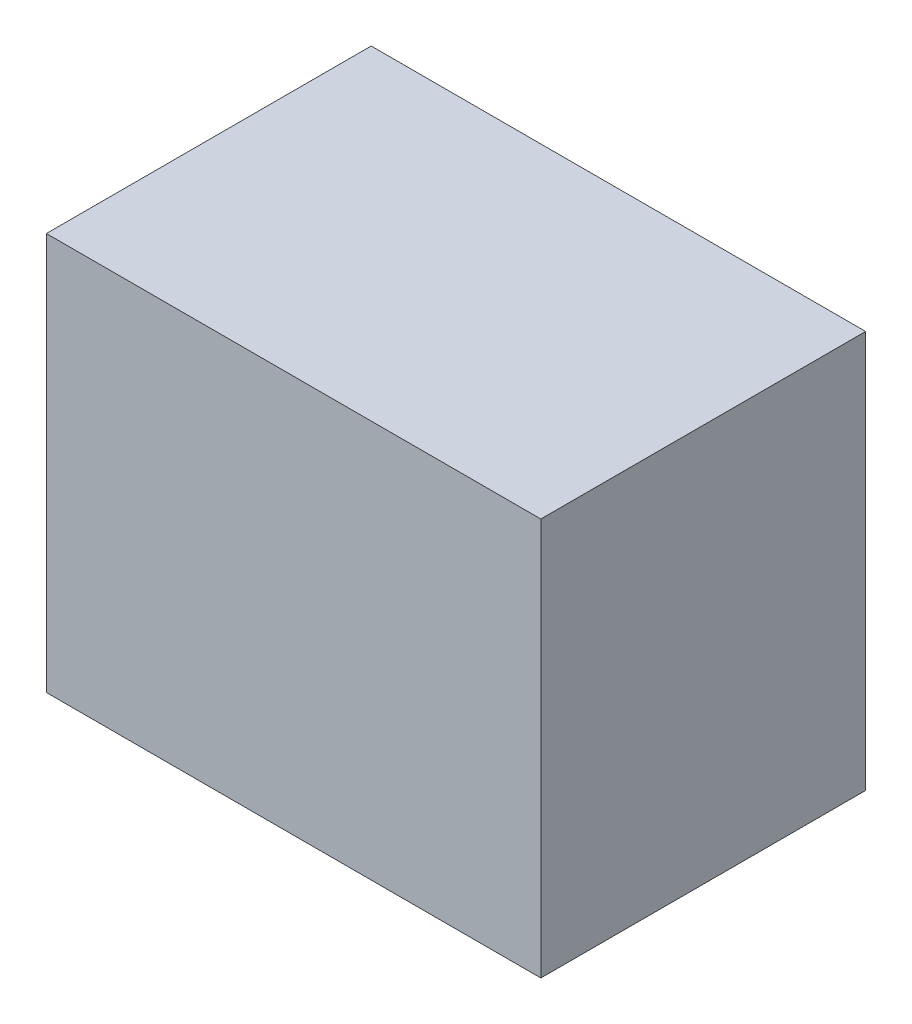
ISO-10303-21;
HEADER;
FILE_DESCRIPTION(('STEP AP214'),'2;1');
FILE_NAME('part.step','',(''),(''),'','','');
FILE_SCHEMA(('AUTOMOTIVE_DESIGN { 1 0 10303 214 1 1 1 1 }'));
ENDSEC;
DATA;
#1=APPLICATION_CONTEXT('core data for automotive mechanical design processes');
#2=APPLICATION_PROTOCOL_DEFINITION('international standard','automotive_design',2000,#1);
#3=PRODUCT_CONTEXT('',#1,'mechanical');
#4=PRODUCT('Part','Part','',(#3));
#5=PRODUCT_RELATED_PRODUCT_CATEGORY('part','',(#4));
#6=PRODUCT_DEFINITION_FORMATION('','',#4);
#7=PRODUCT_DEFINITION_CONTEXT('part definition',#1,'design');
#8=PRODUCT_DEFINITION('design','',#6,#7);
#9=PRODUCT_DEFINITION_SHAPE('','',#8);
#10=(LENGTH_UNIT() NAMED_UNIT(*) SI_UNIT(.MILLI.,.METRE.));
#11=(NAMED_UNIT(*) PLANE_ANGLE_UNIT() SI_UNIT($,.RADIAN.));
#12=(NAMED_UNIT(*) SI_UNIT($,.STERADIAN.) SOLID_ANGLE_UNIT());
#13=UNCERTAINTY_MEASURE_WITH_UNIT(LENGTH_MEASURE(1.E-05),#10,'distance_accuracy_value','');
#14=(GEOMETRIC_REPRESENTATION_CONTEXT(3) GLOBAL_UNCERTAINTY_ASSIGNED_CONTEXT((#13)) GLOBAL_UNIT_ASSIGNED_CONTEXT((#10,
#11,#12)) REPRESENTATION_CONTEXT('',''));
#15=CARTESIAN_POINT('',(0.,0.,0.));
#16=DIRECTION('',(0.,0.,1.));
#17=DIRECTION('',(1.,0.,0.));
#18=AXIS2_PLACEMENT_3D('',#15,#16,#17);
#19=CARTESIAN_POINT('',(0.,208.28,0.));
#20=DIRECTION('',(1.,0.,0.));
#21=DIRECTION('',(0.,0.,-1.));
#22=AXIS2_PLACEMENT_3D('',#19,#20,#21);
#23=PLANE('',#22);
#24=DIRECTION('',(0.,0.,1.));
#25=VECTOR('',#24,1.);
#26=CARTESIAN_POINT('',(0.,0.,0.));
#27=LINE('',#26,#25);
#28=CARTESIAN_POINT('',(0.,0.,-170.18));
#29=VERTEX_POINT('',#28);
#30=CARTESIAN_POINT('',(0.,0.,0.));
#31=VERTEX_POINT('',#30);
#32=EDGE_CURVE('E96',#29,#31,#27,.T.);
#33=ORIENTED_EDGE('',*,*,#32,.T.);
#34=DIRECTION('',(0.,-1.,0.));
#35=VECTOR('',#34,1.);
#36=CARTESIAN_POINT('',(0.,208.28,0.));
#37=LINE('',#36,#35);
#38=CARTESIAN_POINT('',(0.,208.28,0.));
#39=VERTEX_POINT('',#38);
#40=EDGE_CURVE('E11',#39,#31,#37,.T.);
#41=ORIENTED_EDGE('',*,*,#40,.F.);
#42=DIRECTION('',(0.,0.,1.));
#43=VECTOR('',#42,1.);
#44=CARTESIAN_POINT('',(0.,208.28,0.));
#45=LINE('',#44,#43);
#46=CARTESIAN_POINT('',(0.,208.28,-170.18));
#47=VERTEX_POINT('',#46);
#48=EDGE_CURVE('E84',#47,#39,#45,.T.);
#49=ORIENTED_EDGE('',*,*,#48,.F.);
#50=DIRECTION('',(0.,-1.,0.));
#51=VECTOR('',#50,1.);
#52=CARTESIAN_POINT('',(0.,208.28,-170.18));
#53=LINE('',#52,#51);
#54=EDGE_CURVE('E92',#47,#29,#53,.T.);
#55=ORIENTED_EDGE('',*,*,#54,.T.);
#56=EDGE_LOOP('',(#33,#41,#49,#55));
#57=FACE_BOUND('',#56,.T.);
#58=ADVANCED_FACE('F33',(#57),#23,.F.);
#59=CARTESIAN_POINT('',(0.,208.28,0.));
#60=DIRECTION('',(0.,0.,-1.));
#61=DIRECTION('',(-1.,0.,0.));
#62=AXIS2_PLACEMENT_3D('',#59,#60,#61);
#63=PLANE('',#62);
#64=DIRECTION('',(1.,0.,0.));
#65=VECTOR('',#64,1.);
#66=CARTESIAN_POINT('',(0.,0.,0.));
#67=LINE('',#66,#65);
#68=CARTESIAN_POINT('',(259.08,0.,0.));
#69=VERTEX_POINT('',#68);
#70=EDGE_CURVE('E88',#31,#69,#67,.T.);
#71=ORIENTED_EDGE('',*,*,#70,.T.);
#72=DIRECTION('',(0.,-1.,0.));
#73=VECTOR('',#72,1.);
#74=CARTESIAN_POINT('',(259.08,208.28,0.));
#75=LINE('',#74,#73);
#76=CARTESIAN_POINT('',(259.08,208.28,0.));
#77=VERTEX_POINT('',#76);
#78=EDGE_CURVE('E41',#77,#69,#75,.T.);
#79=ORIENTED_EDGE('',*,*,#78,.F.);
#80=DIRECTION('',(1.,0.,0.));
#81=VECTOR('',#80,1.);
#82=CARTESIAN_POINT('',(0.,208.28,0.));
#83=LINE('',#82,#81);
#84=EDGE_CURVE('E79',#39,#77,#83,.T.);
#85=ORIENTED_EDGE('',*,*,#84,.F.);
#86=ORIENTED_EDGE('',*,*,#40,.T.);
#87=EDGE_LOOP('',(#71,#79,#85,#86));
#88=FACE_BOUND('',#87,.T.);
#89=ADVANCED_FACE('F87',(#88),#63,.F.);
#90=CARTESIAN_POINT('',(259.08,208.28,0.));
#91=DIRECTION('',(-1.,0.,0.));
#92=DIRECTION('',(0.,0.,1.));
#93=AXIS2_PLACEMENT_3D('',#90,#91,#92);
#94=PLANE('',#93);
#95=DIRECTION('',(0.,0.,-1.));
#96=VECTOR('',#95,1.);
#97=CARTESIAN_POINT('',(259.08,0.,0.));
#98=LINE('',#97,#96);
#99=CARTESIAN_POINT('',(259.08,0.,-170.18));
#100=VERTEX_POINT('',#99);
#101=EDGE_CURVE('E66',#69,#100,#98,.T.);
#102=ORIENTED_EDGE('',*,*,#101,.T.);
#103=DIRECTION('',(0.,-1.,0.));
#104=VECTOR('',#103,1.);
#105=CARTESIAN_POINT('',(259.08,208.28,-170.18));
#106=LINE('',#105,#104);
#107=CARTESIAN_POINT('',(259.08,208.28,-170.18));
#108=VERTEX_POINT('',#107);
#109=EDGE_CURVE('E89',#108,#100,#106,.T.);
#110=ORIENTED_EDGE('',*,*,#109,.F.);
#111=DIRECTION('',(0.,0.,-1.));
#112=VECTOR('',#111,1.);
#113=CARTESIAN_POINT('',(259.08,208.28,0.));
#114=LINE('',#113,#112);
#115=EDGE_CURVE('E82',#77,#108,#114,.T.);
#116=ORIENTED_EDGE('',*,*,#115,.F.);
#117=ORIENTED_EDGE('',*,*,#78,.T.);
#118=EDGE_LOOP('',(#102,#110,#116,#117));
#119=FACE_BOUND('',#118,.T.);
#120=ADVANCED_FACE('F90',(#119),#94,.F.);
#121=CARTESIAN_POINT('',(0.,208.28,-170.18));
#122=DIRECTION('',(0.,0.,1.));
#123=DIRECTION('',(1.,0.,0.));
#124=AXIS2_PLACEMENT_3D('',#121,#122,#123);
#125=PLANE('',#124);
#126=DIRECTION('',(-1.,0.,0.));
#127=VECTOR('',#126,1.);
#128=CARTESIAN_POINT('',(0.,0.,-170.18));
#129=LINE('',#128,#127);
#130=EDGE_CURVE('E72',#100,#29,#129,.T.);
#131=ORIENTED_EDGE('',*,*,#130,.T.);
#132=ORIENTED_EDGE('',*,*,#54,.F.);
#133=DIRECTION('',(-1.,0.,0.));
#134=VECTOR('',#133,1.);
#135=CARTESIAN_POINT('',(0.,208.28,-170.18));
#136=LINE('',#135,#134);
#137=EDGE_CURVE('E49',#108,#47,#136,.T.);
#138=ORIENTED_EDGE('',*,*,#137,.F.);
#139=ORIENTED_EDGE('',*,*,#109,.T.);
#140=EDGE_LOOP('',(#131,#132,#138,#139));
#141=FACE_BOUND('',#140,.T.);
#142=ADVANCED_FACE('F103',(#141),#125,.F.);
#143=CARTESIAN_POINT('',(0.,208.28,0.));
#144=DIRECTION('',(0.,-1.,0.));
#145=DIRECTION('',(0.,0.,-1.));
#146=AXIS2_PLACEMENT_3D('',#143,#144,#145);
#147=PLANE('',#146);
#148=ORIENTED_EDGE('',*,*,#48,.T.);
#149=ORIENTED_EDGE('',*,*,#84,.T.);
#150=ORIENTED_EDGE('',*,*,#115,.T.);
#151=ORIENTED_EDGE('',*,*,#137,.T.);
#152=EDGE_LOOP('',(#148,#149,#150,#151));
#153=FACE_BOUND('',#152,.T.);
#154=ADVANCED_FACE('F80',(#153),#147,.F.);
#155=CARTESIAN_POINT('',(0.,0.,0.));
#156=DIRECTION('',(0.,-1.,0.));
#157=DIRECTION('',(0.,0.,-1.));
#158=AXIS2_PLACEMENT_3D('',#155,#156,#157);
#159=PLANE('',#158);
#160=ORIENTED_EDGE('',*,*,#32,.F.);
#161=ORIENTED_EDGE('',*,*,#130,.F.);
#162=ORIENTED_EDGE('',*,*,#101,.F.);
#163=ORIENTED_EDGE('',*,*,#70,.F.);
#164=EDGE_LOOP('',(#160,#161,#162,#163));
#165=FACE_BOUND('',#164,.T.);
#166=ADVANCED_FACE('F106',(#165),#159,.T.);
#167=CLOSED_SHELL('',(#58,#89,#120,#142,#154,#166));
#168=MANIFOLD_SOLID_BREP('B2',#167);
#169=ADVANCED_BREP_SHAPE_REPRESENTATION('',(#18,#168),#14);
#170=SHAPE_DEFINITION_REPRESENTATION(#9,#169);
ENDSEC;
END-ISO-10303-21;
